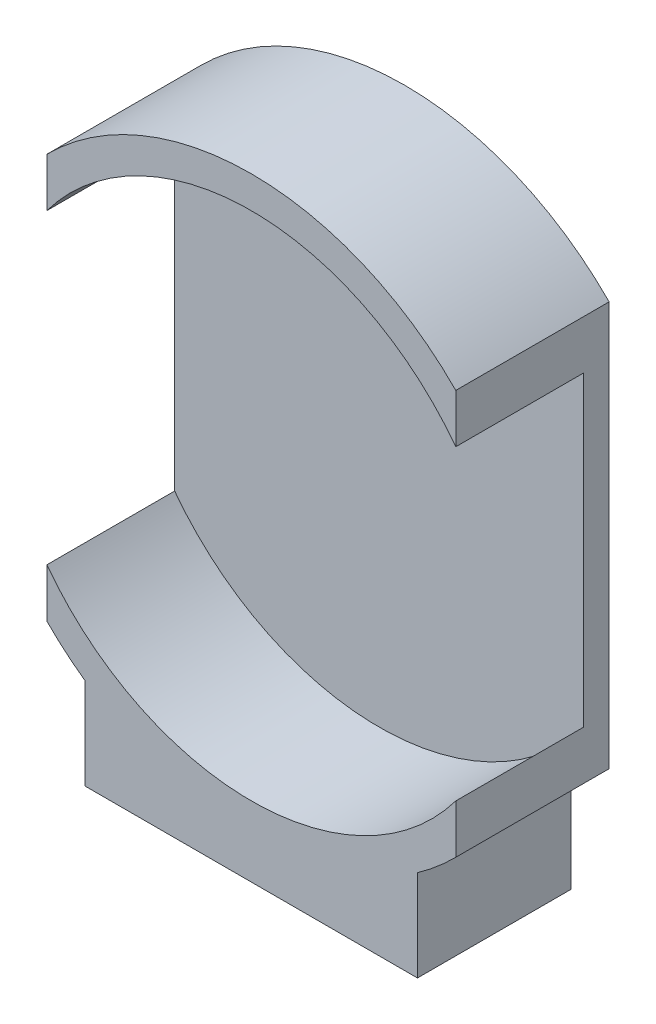
ISO-10303-21;
HEADER;
FILE_DESCRIPTION(('STEP AP214'),'2;1');
FILE_NAME('part.step','',(''),(''),'','','');
FILE_SCHEMA(('AUTOMOTIVE_DESIGN { 1 0 10303 214 1 1 1 1 }'));
ENDSEC;
DATA;
#1=APPLICATION_CONTEXT('core data for automotive mechanical design processes');
#2=APPLICATION_PROTOCOL_DEFINITION('international standard','automotive_design',2000,#1);
#3=PRODUCT_CONTEXT('',#1,'mechanical');
#4=PRODUCT('Part','Part','',(#3));
#5=PRODUCT_RELATED_PRODUCT_CATEGORY('part','',(#4));
#6=PRODUCT_DEFINITION_FORMATION('','',#4);
#7=PRODUCT_DEFINITION_CONTEXT('part definition',#1,'design');
#8=PRODUCT_DEFINITION('design','',#6,#7);
#9=PRODUCT_DEFINITION_SHAPE('','',#8);
#10=(LENGTH_UNIT() NAMED_UNIT(*) SI_UNIT(.MILLI.,.METRE.));
#11=(NAMED_UNIT(*) PLANE_ANGLE_UNIT() SI_UNIT($,.RADIAN.));
#12=(NAMED_UNIT(*) SI_UNIT($,.STERADIAN.) SOLID_ANGLE_UNIT());
#13=UNCERTAINTY_MEASURE_WITH_UNIT(LENGTH_MEASURE(1.E-05),#10,'distance_accuracy_value','');
#14=(GEOMETRIC_REPRESENTATION_CONTEXT(3) GLOBAL_UNCERTAINTY_ASSIGNED_CONTEXT((#13)) GLOBAL_UNIT_ASSIGNED_CONTEXT((#10,
#11,#12)) REPRESENTATION_CONTEXT('',''));
#15=CARTESIAN_POINT('',(0.,0.,0.));
#16=DIRECTION('',(0.,0.,1.));
#17=DIRECTION('',(1.,0.,0.));
#18=AXIS2_PLACEMENT_3D('',#15,#16,#17);
#19=CARTESIAN_POINT('',(-6.5,-12.75,27.4009345590327));
#20=DIRECTION('',(0.,1.,0.));
#21=DIRECTION('',(-1.,0.,0.));
#22=AXIS2_PLACEMENT_3D('',#19,#20,#21);
#23=PLANE('',#22);
#24=DIRECTION('',(0.,0.,-1.));
#25=VECTOR('',#24,1.);
#26=CARTESIAN_POINT('',(-1.5,-12.75,0.3));
#27=LINE('',#26,#25);
#28=CARTESIAN_POINT('',(-1.5,-12.75,0.3));
#29=VERTEX_POINT('',#28);
#30=CARTESIAN_POINT('',(-1.5,-12.75,0.));
#31=VERTEX_POINT('',#30);
#32=EDGE_CURVE('E39',#29,#31,#27,.T.);
#33=ORIENTED_EDGE('',*,*,#32,.F.);
#34=DIRECTION('',(-1.,0.,0.));
#35=VECTOR('',#34,1.);
#36=CARTESIAN_POINT('',(-1.5,-12.75,0.3));
#37=LINE('',#36,#35);
#38=CARTESIAN_POINT('',(1.5,-12.75,0.3));
#39=VERTEX_POINT('',#38);
#40=EDGE_CURVE('E170',#39,#29,#37,.T.);
#41=ORIENTED_EDGE('',*,*,#40,.F.);
#42=DIRECTION('',(0.,0.,1.));
#43=VECTOR('',#42,1.);
#44=CARTESIAN_POINT('',(1.5,-12.75,0.3));
#45=LINE('',#44,#43);
#46=CARTESIAN_POINT('',(1.5,-12.75,0.));
#47=VERTEX_POINT('',#46);
#48=EDGE_CURVE('E58',#47,#39,#45,.T.);
#49=ORIENTED_EDGE('',*,*,#48,.F.);
#50=DIRECTION('',(1.,0.,0.));
#51=VECTOR('',#50,1.);
#52=CARTESIAN_POINT('',(-6.5,-12.75,0.));
#53=LINE('',#52,#51);
#54=CARTESIAN_POINT('',(6.5,-12.75,0.));
#55=VERTEX_POINT('',#54);
#56=EDGE_CURVE('E186',#47,#55,#53,.T.);
#57=ORIENTED_EDGE('',*,*,#56,.T.);
#58=DIRECTION('',(0.,0.,-1.));
#59=VECTOR('',#58,1.);
#60=CARTESIAN_POINT('',(6.5,-12.75,27.4009345590327));
#61=LINE('',#60,#59);
#62=CARTESIAN_POINT('',(6.5,-12.75,6.00000000000001));
#63=VERTEX_POINT('',#62);
#64=EDGE_CURVE('E210',#63,#55,#61,.T.);
#65=ORIENTED_EDGE('',*,*,#64,.F.);
#66=DIRECTION('',(1.,0.,0.));
#67=VECTOR('',#66,1.);
#68=CARTESIAN_POINT('',(-6.5,-12.75,6.));
#69=LINE('',#68,#67);
#70=CARTESIAN_POINT('',(-6.5,-12.75,6.00000000000001));
#71=VERTEX_POINT('',#70);
#72=EDGE_CURVE('E203',#71,#63,#69,.T.);
#73=ORIENTED_EDGE('',*,*,#72,.F.);
#74=DIRECTION('',(0.,0.,-1.));
#75=VECTOR('',#74,1.);
#76=CARTESIAN_POINT('',(-6.5,-12.75,27.4009345590327));
#77=LINE('',#76,#75);
#78=CARTESIAN_POINT('',(-6.5,-12.75,0.));
#79=VERTEX_POINT('',#78);
#80=EDGE_CURVE('E190',#71,#79,#77,.T.);
#81=ORIENTED_EDGE('',*,*,#80,.T.);
#82=EDGE_CURVE('E189',#79,#31,#53,.T.);
#83=ORIENTED_EDGE('',*,*,#82,.T.);
#84=EDGE_LOOP('',(#33,#41,#49,#57,#65,#73,#81,#83));
#85=FACE_BOUND('',#84,.T.);
#86=ADVANCED_FACE('F35',(#85),#23,.F.);
#87=CARTESIAN_POINT('',(0.,0.,6.));
#88=DIRECTION('',(0.,0.,1.));
#89=DIRECTION('',(1.,0.,0.));
#90=AXIS2_PLACEMENT_3D('',#87,#88,#89);
#91=PLANE('',#90);
#92=CARTESIAN_POINT('',(0.,0.,6.));
#93=DIRECTION('',(0.,0.,1.));
#94=DIRECTION('',(1.,0.,0.));
#95=AXIS2_PLACEMENT_3D('',#92,#93,#94);
#96=CIRCLE('',#95,10.);
#97=CARTESIAN_POINT('',(8.,6.,6.));
#98=VERTEX_POINT('',#97);
#99=CARTESIAN_POINT('',(-8.,6.,6.));
#100=VERTEX_POINT('',#99);
#101=EDGE_CURVE('E175',#98,#100,#96,.T.);
#102=ORIENTED_EDGE('',*,*,#101,.F.);
#103=DIRECTION('',(0.,1.,0.));
#104=VECTOR('',#103,1.);
#105=CARTESIAN_POINT('',(8.,12.5,6.));
#106=LINE('',#105,#104);
#107=CARTESIAN_POINT('',(8.,7.90964600977818,6.));
#108=VERTEX_POINT('',#107);
#109=EDGE_CURVE('E217',#98,#108,#106,.T.);
#110=ORIENTED_EDGE('',*,*,#109,.T.);
#111=CARTESIAN_POINT('',(0.,0.,6.));
#112=DIRECTION('',(0.,0.,1.));
#113=DIRECTION('',(1.,0.,0.));
#114=AXIS2_PLACEMENT_3D('',#111,#112,#113);
#115=CIRCLE('',#114,11.25);
#116=CARTESIAN_POINT('',(-8.,7.90964600977818,6.));
#117=VERTEX_POINT('',#116);
#118=EDGE_CURVE('E238',#108,#117,#115,.T.);
#119=ORIENTED_EDGE('',*,*,#118,.T.);
#120=DIRECTION('',(0.,-1.,0.));
#121=VECTOR('',#120,1.);
#122=CARTESIAN_POINT('',(-8.,12.5,6.));
#123=LINE('',#122,#121);
#124=EDGE_CURVE('E222',#117,#100,#123,.T.);
#125=ORIENTED_EDGE('',*,*,#124,.T.);
#126=EDGE_LOOP('',(#102,#110,#119,#125));
#127=FACE_BOUND('',#126,.T.);
#128=ADVANCED_FACE('F269',(#127),#91,.T.);
#129=CARTESIAN_POINT('',(0.,0.,6.));
#130=DIRECTION('',(0.,0.,-1.));
#131=DIRECTION('',(-1.,0.,0.));
#132=AXIS2_PLACEMENT_3D('',#129,#130,#131);
#133=CYLINDRICAL_SURFACE('',#132,11.25);
#134=DIRECTION('',(0.,0.,-1.));
#135=VECTOR('',#134,1.);
#136=CARTESIAN_POINT('',(-6.5,-9.18218383610348,6.));
#137=LINE('',#136,#135);
#138=CARTESIAN_POINT('',(-6.5,-9.18218383610348,6.));
#139=VERTEX_POINT('',#138);
#140=CARTESIAN_POINT('',(-6.5,-9.18218383610348,0.));
#141=VERTEX_POINT('',#140);
#142=EDGE_CURVE('E215',#139,#141,#137,.T.);
#143=ORIENTED_EDGE('',*,*,#142,.F.);
#144=CARTESIAN_POINT('',(-8.,-7.90964600977819,6.));
#145=VERTEX_POINT('',#144);
#146=EDGE_CURVE('E242',#145,#139,#115,.T.);
#147=ORIENTED_EDGE('',*,*,#146,.F.);
#148=DIRECTION('',(0.,0.,-1.));
#149=VECTOR('',#148,1.);
#150=CARTESIAN_POINT('',(-8.,-7.90964600977818,6.));
#151=LINE('',#150,#149);
#152=CARTESIAN_POINT('',(-8.,-7.90964600977819,0.));
#153=VERTEX_POINT('',#152);
#154=EDGE_CURVE('E228',#145,#153,#151,.T.);
#155=ORIENTED_EDGE('',*,*,#154,.T.);
#156=CARTESIAN_POINT('',(0.,0.,0.));
#157=DIRECTION('',(0.,0.,1.));
#158=DIRECTION('',(1.,0.,0.));
#159=AXIS2_PLACEMENT_3D('',#156,#157,#158);
#160=CIRCLE('',#159,11.25);
#161=EDGE_CURVE('E247',#153,#141,#160,.T.);
#162=ORIENTED_EDGE('',*,*,#161,.T.);
#163=EDGE_LOOP('',(#143,#147,#155,#162));
#164=FACE_BOUND('',#163,.T.);
#165=ADVANCED_FACE('F37',(#164),#133,.T.);
#166=DIRECTION('',(0.,0.,-1.));
#167=VECTOR('',#166,1.);
#168=CARTESIAN_POINT('',(6.5,-9.18218383610347,6.));
#169=LINE('',#168,#167);
#170=CARTESIAN_POINT('',(6.5,-9.18218383610347,0.));
#171=VERTEX_POINT('',#170);
#172=CARTESIAN_POINT('',(6.5,-9.18218383610347,6.));
#173=VERTEX_POINT('',#172);
#174=EDGE_CURVE('E202',#171,#173,#169,.F.);
#175=ORIENTED_EDGE('',*,*,#174,.F.);
#176=CARTESIAN_POINT('',(8.,-7.90964600977818,0.));
#177=VERTEX_POINT('',#176);
#178=EDGE_CURVE('E237',#171,#177,#160,.T.);
#179=ORIENTED_EDGE('',*,*,#178,.T.);
#180=DIRECTION('',(0.,0.,-1.));
#181=VECTOR('',#180,1.);
#182=CARTESIAN_POINT('',(8.,-7.90964600977818,6.));
#183=LINE('',#182,#181);
#184=CARTESIAN_POINT('',(8.,-7.90964600977818,6.));
#185=VERTEX_POINT('',#184);
#186=EDGE_CURVE('E231',#177,#185,#183,.F.);
#187=ORIENTED_EDGE('',*,*,#186,.T.);
#188=EDGE_CURVE('E243',#173,#185,#115,.T.);
#189=ORIENTED_EDGE('',*,*,#188,.F.);
#190=EDGE_LOOP('',(#175,#179,#187,#189));
#191=FACE_BOUND('',#190,.T.);
#192=ADVANCED_FACE('F314',(#191),#133,.T.);
#193=ORIENTED_EDGE('',*,*,#118,.F.);
#194=DIRECTION('',(0.,0.,-1.));
#195=VECTOR('',#194,1.);
#196=CARTESIAN_POINT('',(8.,7.90964600977818,6.));
#197=LINE('',#196,#195);
#198=CARTESIAN_POINT('',(8.,7.90964600977818,0.));
#199=VERTEX_POINT('',#198);
#200=EDGE_CURVE('E234',#108,#199,#197,.T.);
#201=ORIENTED_EDGE('',*,*,#200,.T.);
#202=CARTESIAN_POINT('',(-8.,7.90964600977818,0.));
#203=VERTEX_POINT('',#202);
#204=EDGE_CURVE('E244',#199,#203,#160,.T.);
#205=ORIENTED_EDGE('',*,*,#204,.T.);
#206=DIRECTION('',(0.,0.,-1.));
#207=VECTOR('',#206,1.);
#208=CARTESIAN_POINT('',(-8.,7.90964600977818,6.));
#209=LINE('',#208,#207);
#210=EDGE_CURVE('E225',#203,#117,#209,.F.);
#211=ORIENTED_EDGE('',*,*,#210,.T.);
#212=EDGE_LOOP('',(#193,#201,#205,#211));
#213=FACE_BOUND('',#212,.T.);
#214=ADVANCED_FACE('F317',(#213),#133,.T.);
#215=CARTESIAN_POINT('',(-8.,-6.,6.));
#216=VERTEX_POINT('',#215);
#217=CARTESIAN_POINT('',(8.,-6.,6.));
#218=VERTEX_POINT('',#217);
#219=EDGE_CURVE('E173',#216,#218,#96,.T.);
#220=ORIENTED_EDGE('',*,*,#219,.F.);
#221=EDGE_CURVE('E221',#216,#145,#123,.T.);
#222=ORIENTED_EDGE('',*,*,#221,.T.);
#223=ORIENTED_EDGE('',*,*,#146,.T.);
#224=DIRECTION('',(0.,-1.,0.));
#225=VECTOR('',#224,1.);
#226=CARTESIAN_POINT('',(-6.5,4.25,6.));
#227=LINE('',#226,#225);
#228=EDGE_CURVE('E206',#139,#71,#227,.T.);
#229=ORIENTED_EDGE('',*,*,#228,.T.);
#230=ORIENTED_EDGE('',*,*,#72,.T.);
#231=DIRECTION('',(0.,1.,0.));
#232=VECTOR('',#231,1.);
#233=CARTESIAN_POINT('',(6.5,4.25,6.));
#234=LINE('',#233,#232);
#235=EDGE_CURVE('E200',#63,#173,#234,.T.);
#236=ORIENTED_EDGE('',*,*,#235,.T.);
#237=ORIENTED_EDGE('',*,*,#188,.T.);
#238=EDGE_CURVE('E218',#185,#218,#106,.T.);
#239=ORIENTED_EDGE('',*,*,#238,.T.);
#240=EDGE_LOOP('',(#220,#222,#223,#229,#230,#236,#237,#239));
#241=FACE_BOUND('',#240,.T.);
#242=ADVANCED_FACE('F292',(#241),#91,.T.);
#243=CARTESIAN_POINT('',(0.,0.,0.));
#244=DIRECTION('',(0.,0.,1.));
#245=DIRECTION('',(1.,0.,0.));
#246=AXIS2_PLACEMENT_3D('',#243,#244,#245);
#247=PLANE('',#246);
#248=ORIENTED_EDGE('',*,*,#178,.F.);
#249=DIRECTION('',(0.,1.,0.));
#250=VECTOR('',#249,1.);
#251=CARTESIAN_POINT('',(6.5,4.25,0.));
#252=LINE('',#251,#250);
#253=EDGE_CURVE('E194',#55,#171,#252,.T.);
#254=ORIENTED_EDGE('',*,*,#253,.F.);
#255=ORIENTED_EDGE('',*,*,#56,.F.);
#256=DIRECTION('',(0.,1.,0.));
#257=VECTOR('',#256,1.);
#258=CARTESIAN_POINT('',(1.5,-14.35,0.));
#259=LINE('',#258,#257);
#260=CARTESIAN_POINT('',(1.5,-14.35,0.));
#261=VERTEX_POINT('',#260);
#262=EDGE_CURVE('E157',#261,#47,#259,.T.);
#263=ORIENTED_EDGE('',*,*,#262,.F.);
#264=DIRECTION('',(1.,0.,0.));
#265=VECTOR('',#264,1.);
#266=CARTESIAN_POINT('',(-1.5,-14.35,0.));
#267=LINE('',#266,#265);
#268=CARTESIAN_POINT('',(-1.5,-14.35,0.));
#269=VERTEX_POINT('',#268);
#270=EDGE_CURVE('E149',#269,#261,#267,.T.);
#271=ORIENTED_EDGE('',*,*,#270,.F.);
#272=DIRECTION('',(0.,1.,0.));
#273=VECTOR('',#272,1.);
#274=CARTESIAN_POINT('',(-1.5,-14.35,0.));
#275=LINE('',#274,#273);
#276=EDGE_CURVE('E155',#269,#31,#275,.T.);
#277=ORIENTED_EDGE('',*,*,#276,.T.);
#278=ORIENTED_EDGE('',*,*,#82,.F.);
#279=DIRECTION('',(0.,-1.,0.));
#280=VECTOR('',#279,1.);
#281=CARTESIAN_POINT('',(-6.5,4.25,0.));
#282=LINE('',#281,#280);
#283=EDGE_CURVE('E196',#141,#79,#282,.T.);
#284=ORIENTED_EDGE('',*,*,#283,.F.);
#285=ORIENTED_EDGE('',*,*,#161,.F.);
#286=DIRECTION('',(0.,1.,0.));
#287=VECTOR('',#286,1.);
#288=CARTESIAN_POINT('',(-8.,0.,0.));
#289=LINE('',#288,#287);
#290=EDGE_CURVE('E241',#153,#203,#289,.T.);
#291=ORIENTED_EDGE('',*,*,#290,.T.);
#292=ORIENTED_EDGE('',*,*,#204,.F.);
#293=DIRECTION('',(0.,-1.,0.));
#294=VECTOR('',#293,1.);
#295=CARTESIAN_POINT('',(8.,0.,0.));
#296=LINE('',#295,#294);
#297=EDGE_CURVE('E250',#199,#177,#296,.T.);
#298=ORIENTED_EDGE('',*,*,#297,.T.);
#299=EDGE_LOOP('',(#248,#254,#255,#263,#271,#277,#278,#284,#285,#291,#292,#298));
#300=FACE_BOUND('',#299,.T.);
#301=ADVANCED_FACE('F152',(#300),#247,.F.);
#302=CARTESIAN_POINT('',(-8.,12.5,6.));
#303=DIRECTION('',(1.,0.,0.));
#304=DIRECTION('',(0.,1.,0.));
#305=AXIS2_PLACEMENT_3D('',#302,#303,#304);
#306=PLANE('',#305);
#307=DIRECTION('',(0.,-1.,0.));
#308=VECTOR('',#307,1.);
#309=CARTESIAN_POINT('',(-8.,12.5,1.));
#310=LINE('',#309,#308);
#311=CARTESIAN_POINT('',(-8.,6.,1.));
#312=VERTEX_POINT('',#311);
#313=CARTESIAN_POINT('',(-8.,-6.,1.));
#314=VERTEX_POINT('',#313);
#315=EDGE_CURVE('E276',#312,#314,#310,.T.);
#316=ORIENTED_EDGE('',*,*,#315,.F.);
#317=DIRECTION('',(0.,0.,1.));
#318=VECTOR('',#317,1.);
#319=CARTESIAN_POINT('',(-8.,6.,-28.2842712474619));
#320=LINE('',#319,#318);
#321=EDGE_CURVE('E199',#312,#100,#320,.T.);
#322=ORIENTED_EDGE('',*,*,#321,.T.);
#323=ORIENTED_EDGE('',*,*,#124,.F.);
#324=ORIENTED_EDGE('',*,*,#210,.F.);
#325=ORIENTED_EDGE('',*,*,#290,.F.);
#326=ORIENTED_EDGE('',*,*,#154,.F.);
#327=ORIENTED_EDGE('',*,*,#221,.F.);
#328=DIRECTION('',(0.,0.,1.));
#329=VECTOR('',#328,1.);
#330=CARTESIAN_POINT('',(-8.,-6.,-28.2842712474619));
#331=LINE('',#330,#329);
#332=EDGE_CURVE('E278',#216,#314,#331,.F.);
#333=ORIENTED_EDGE('',*,*,#332,.T.);
#334=EDGE_LOOP('',(#316,#322,#323,#324,#325,#326,#327,#333));
#335=FACE_BOUND('',#334,.T.);
#336=ADVANCED_FACE('F282',(#335),#306,.F.);
#337=CARTESIAN_POINT('',(8.,12.5,6.));
#338=DIRECTION('',(-1.,0.,0.));
#339=DIRECTION('',(0.,-1.,0.));
#340=AXIS2_PLACEMENT_3D('',#337,#338,#339);
#341=PLANE('',#340);
#342=DIRECTION('',(0.,1.,0.));
#343=VECTOR('',#342,1.);
#344=CARTESIAN_POINT('',(8.,12.5,1.));
#345=LINE('',#344,#343);
#346=CARTESIAN_POINT('',(8.,-6.,1.));
#347=VERTEX_POINT('',#346);
#348=CARTESIAN_POINT('',(8.,6.,1.));
#349=VERTEX_POINT('',#348);
#350=EDGE_CURVE('E253',#347,#349,#345,.T.);
#351=ORIENTED_EDGE('',*,*,#350,.F.);
#352=DIRECTION('',(0.,0.,1.));
#353=VECTOR('',#352,1.);
#354=CARTESIAN_POINT('',(8.,-6.,-28.2842712474619));
#355=LINE('',#354,#353);
#356=EDGE_CURVE('E12',#347,#218,#355,.T.);
#357=ORIENTED_EDGE('',*,*,#356,.T.);
#358=ORIENTED_EDGE('',*,*,#238,.F.);
#359=ORIENTED_EDGE('',*,*,#186,.F.);
#360=ORIENTED_EDGE('',*,*,#297,.F.);
#361=ORIENTED_EDGE('',*,*,#200,.F.);
#362=ORIENTED_EDGE('',*,*,#109,.F.);
#363=DIRECTION('',(0.,0.,1.));
#364=VECTOR('',#363,1.);
#365=CARTESIAN_POINT('',(8.,6.,-28.2842712474619));
#366=LINE('',#365,#364);
#367=EDGE_CURVE('E45',#98,#349,#366,.F.);
#368=ORIENTED_EDGE('',*,*,#367,.T.);
#369=EDGE_LOOP('',(#351,#357,#358,#359,#360,#361,#362,#368));
#370=FACE_BOUND('',#369,.T.);
#371=ADVANCED_FACE('F259',(#370),#341,.F.);
#372=CARTESIAN_POINT('',(-6.5,4.25,27.4009345590327));
#373=DIRECTION('',(1.,0.,0.));
#374=DIRECTION('',(0.,1.,0.));
#375=AXIS2_PLACEMENT_3D('',#372,#373,#374);
#376=PLANE('',#375);
#377=ORIENTED_EDGE('',*,*,#228,.F.);
#378=ORIENTED_EDGE('',*,*,#142,.T.);
#379=ORIENTED_EDGE('',*,*,#283,.T.);
#380=ORIENTED_EDGE('',*,*,#80,.F.);
#381=EDGE_LOOP('',(#377,#378,#379,#380));
#382=FACE_BOUND('',#381,.T.);
#383=ADVANCED_FACE('F307',(#382),#376,.F.);
#384=CARTESIAN_POINT('',(6.5,4.25,27.4009345590327));
#385=DIRECTION('',(-1.,0.,0.));
#386=DIRECTION('',(0.,-1.,0.));
#387=AXIS2_PLACEMENT_3D('',#384,#385,#386);
#388=PLANE('',#387);
#389=ORIENTED_EDGE('',*,*,#253,.T.);
#390=ORIENTED_EDGE('',*,*,#174,.T.);
#391=ORIENTED_EDGE('',*,*,#235,.F.);
#392=ORIENTED_EDGE('',*,*,#64,.T.);
#393=EDGE_LOOP('',(#389,#390,#391,#392));
#394=FACE_BOUND('',#393,.T.);
#395=ADVANCED_FACE('F312',(#394),#388,.F.);
#396=CARTESIAN_POINT('',(0.,0.,-28.2842712474619));
#397=DIRECTION('',(0.,0.,1.));
#398=DIRECTION('',(1.,0.,0.));
#399=AXIS2_PLACEMENT_3D('',#396,#397,#398);
#400=CYLINDRICAL_SURFACE('',#399,10.);
#401=CARTESIAN_POINT('',(0.,0.,1.));
#402=DIRECTION('',(0.,0.,1.));
#403=DIRECTION('',(1.,0.,0.));
#404=AXIS2_PLACEMENT_3D('',#401,#402,#403);
#405=CIRCLE('',#404,10.);
#406=EDGE_CURVE('E267',#312,#349,#405,.F.);
#407=ORIENTED_EDGE('',*,*,#406,.T.);
#408=ORIENTED_EDGE('',*,*,#367,.F.);
#409=ORIENTED_EDGE('',*,*,#101,.T.);
#410=ORIENTED_EDGE('',*,*,#321,.F.);
#411=EDGE_LOOP('',(#407,#408,#409,#410));
#412=FACE_BOUND('',#411,.T.);
#413=ADVANCED_FACE('F264',(#412),#400,.F.);
#414=ORIENTED_EDGE('',*,*,#219,.T.);
#415=ORIENTED_EDGE('',*,*,#356,.F.);
#416=EDGE_CURVE('E270',#347,#314,#405,.F.);
#417=ORIENTED_EDGE('',*,*,#416,.T.);
#418=ORIENTED_EDGE('',*,*,#332,.F.);
#419=EDGE_LOOP('',(#414,#415,#417,#418));
#420=FACE_BOUND('',#419,.T.);
#421=ADVANCED_FACE('F287',(#420),#400,.F.);
#422=CARTESIAN_POINT('',(0.,0.,1.));
#423=DIRECTION('',(0.,0.,1.));
#424=DIRECTION('',(1.,0.,0.));
#425=AXIS2_PLACEMENT_3D('',#422,#423,#424);
#426=PLANE('',#425);
#427=ORIENTED_EDGE('',*,*,#315,.T.);
#428=ORIENTED_EDGE('',*,*,#416,.F.);
#429=ORIENTED_EDGE('',*,*,#350,.T.);
#430=ORIENTED_EDGE('',*,*,#406,.F.);
#431=EDGE_LOOP('',(#427,#428,#429,#430));
#432=FACE_BOUND('',#431,.T.);
#433=ADVANCED_FACE('F284',(#432),#426,.T.);
#434=CARTESIAN_POINT('',(-1.5,-14.35,0.3));
#435=DIRECTION('',(1.,0.,0.));
#436=DIRECTION('',(0.,1.,0.));
#437=AXIS2_PLACEMENT_3D('',#434,#435,#436);
#438=PLANE('',#437);
#439=ORIENTED_EDGE('',*,*,#32,.T.);
#440=ORIENTED_EDGE('',*,*,#276,.F.);
#441=DIRECTION('',(0.,0.,-1.));
#442=VECTOR('',#441,1.);
#443=CARTESIAN_POINT('',(-1.5,-14.35,0.3));
#444=LINE('',#443,#442);
#445=CARTESIAN_POINT('',(-1.5,-14.35,0.3));
#446=VERTEX_POINT('',#445);
#447=EDGE_CURVE('E161',#446,#269,#444,.T.);
#448=ORIENTED_EDGE('',*,*,#447,.F.);
#449=DIRECTION('',(0.,1.,0.));
#450=VECTOR('',#449,1.);
#451=CARTESIAN_POINT('',(-1.5,-14.35,0.3));
#452=LINE('',#451,#450);
#453=EDGE_CURVE('E473',#446,#29,#452,.T.);
#454=ORIENTED_EDGE('',*,*,#453,.T.);
#455=EDGE_LOOP('',(#439,#440,#448,#454));
#456=FACE_BOUND('',#455,.T.);
#457=ADVANCED_FACE('F172',(#456),#438,.F.);
#458=CARTESIAN_POINT('',(1.5,-14.35,0.3));
#459=DIRECTION('',(-1.,0.,0.));
#460=DIRECTION('',(0.,-1.,0.));
#461=AXIS2_PLACEMENT_3D('',#458,#459,#460);
#462=PLANE('',#461);
#463=ORIENTED_EDGE('',*,*,#48,.T.);
#464=DIRECTION('',(0.,1.,0.));
#465=VECTOR('',#464,1.);
#466=CARTESIAN_POINT('',(1.5,-14.35,0.3));
#467=LINE('',#466,#465);
#468=CARTESIAN_POINT('',(1.5,-14.35,0.3));
#469=VERTEX_POINT('',#468);
#470=EDGE_CURVE('E177',#469,#39,#467,.T.);
#471=ORIENTED_EDGE('',*,*,#470,.F.);
#472=DIRECTION('',(0.,0.,1.));
#473=VECTOR('',#472,1.);
#474=CARTESIAN_POINT('',(1.5,-14.35,0.3));
#475=LINE('',#474,#473);
#476=EDGE_CURVE('E160',#261,#469,#475,.T.);
#477=ORIENTED_EDGE('',*,*,#476,.F.);
#478=ORIENTED_EDGE('',*,*,#262,.T.);
#479=EDGE_LOOP('',(#463,#471,#477,#478));
#480=FACE_BOUND('',#479,.T.);
#481=ADVANCED_FACE('F384',(#480),#462,.F.);
#482=CARTESIAN_POINT('',(-1.5,-14.35,0.3));
#483=DIRECTION('',(0.,0.,-1.));
#484=DIRECTION('',(-1.,0.,0.));
#485=AXIS2_PLACEMENT_3D('',#482,#483,#484);
#486=PLANE('',#485);
#487=ORIENTED_EDGE('',*,*,#40,.T.);
#488=ORIENTED_EDGE('',*,*,#453,.F.);
#489=DIRECTION('',(-1.,0.,0.));
#490=VECTOR('',#489,1.);
#491=CARTESIAN_POINT('',(-1.5,-14.35,0.3));
#492=LINE('',#491,#490);
#493=EDGE_CURVE('E166',#469,#446,#492,.T.);
#494=ORIENTED_EDGE('',*,*,#493,.F.);
#495=ORIENTED_EDGE('',*,*,#470,.T.);
#496=EDGE_LOOP('',(#487,#488,#494,#495));
#497=FACE_BOUND('',#496,.T.);
#498=ADVANCED_FACE('F391',(#497),#486,.F.);
#499=CARTESIAN_POINT('',(0.,-14.35,0.));
#500=DIRECTION('',(0.,-1.,0.));
#501=DIRECTION('',(0.,0.,-1.));
#502=AXIS2_PLACEMENT_3D('',#499,#500,#501);
#503=PLANE('',#502);
#504=ORIENTED_EDGE('',*,*,#447,.T.);
#505=ORIENTED_EDGE('',*,*,#270,.T.);
#506=ORIENTED_EDGE('',*,*,#476,.T.);
#507=ORIENTED_EDGE('',*,*,#493,.T.);
#508=EDGE_LOOP('',(#504,#505,#506,#507));
#509=FACE_BOUND('',#508,.T.);
#510=ADVANCED_FACE('F164',(#509),#503,.T.);
#511=CLOSED_SHELL('',(#86,#128,#165,#192,#214,#242,#301,#336,#371,#383,#395,#413,#421,#433,#457,
#481,#498,#510));
#512=MANIFOLD_SOLID_BREP('B2',#511);
#513=ADVANCED_BREP_SHAPE_REPRESENTATION('',(#18,#512),#14);
#514=SHAPE_DEFINITION_REPRESENTATION(#9,#513);
ENDSEC;
END-ISO-10303-21;
